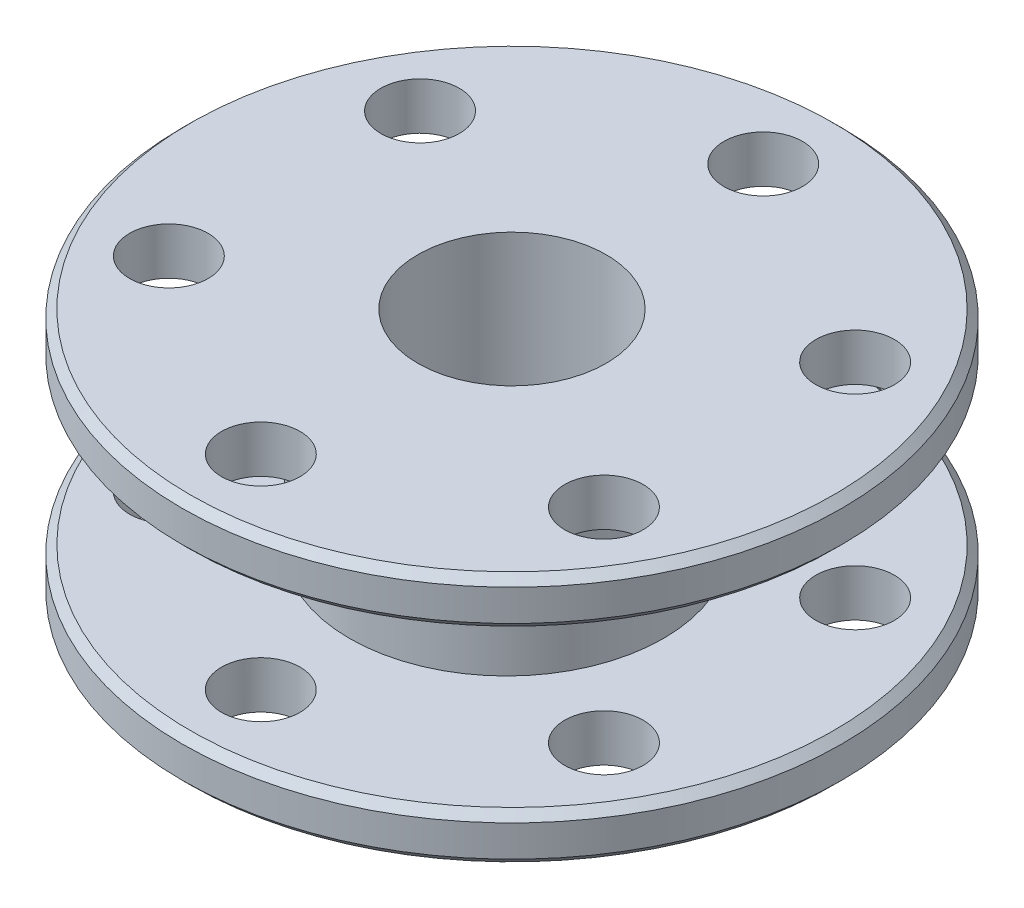
ISO-10303-21;
HEADER;
FILE_DESCRIPTION(('STEP AP214'),'2;1');
FILE_NAME('part.step','',(''),(''),'','','');
FILE_SCHEMA(('AUTOMOTIVE_DESIGN { 1 0 10303 214 1 1 1 1 }'));
ENDSEC;
DATA;
#1=APPLICATION_CONTEXT('core data for automotive mechanical design processes');
#2=APPLICATION_PROTOCOL_DEFINITION('international standard','automotive_design',2000,#1);
#3=PRODUCT_CONTEXT('',#1,'mechanical');
#4=PRODUCT('Part','Part','',(#3));
#5=PRODUCT_RELATED_PRODUCT_CATEGORY('part','',(#4));
#6=PRODUCT_DEFINITION_FORMATION('','',#4);
#7=PRODUCT_DEFINITION_CONTEXT('part definition',#1,'design');
#8=PRODUCT_DEFINITION('design','',#6,#7);
#9=PRODUCT_DEFINITION_SHAPE('','',#8);
#10=(LENGTH_UNIT() NAMED_UNIT(*) SI_UNIT(.MILLI.,.METRE.));
#11=(NAMED_UNIT(*) PLANE_ANGLE_UNIT() SI_UNIT($,.RADIAN.));
#12=(NAMED_UNIT(*) SI_UNIT($,.STERADIAN.) SOLID_ANGLE_UNIT());
#13=UNCERTAINTY_MEASURE_WITH_UNIT(LENGTH_MEASURE(1.E-05),#10,'distance_accuracy_value','');
#14=(GEOMETRIC_REPRESENTATION_CONTEXT(3) GLOBAL_UNCERTAINTY_ASSIGNED_CONTEXT((#13)) GLOBAL_UNIT_ASSIGNED_CONTEXT((#10,
#11,#12)) REPRESENTATION_CONTEXT('',''));
#15=CARTESIAN_POINT('',(0.,0.,0.));
#16=DIRECTION('',(0.,0.,1.));
#17=DIRECTION('',(1.,0.,0.));
#18=AXIS2_PLACEMENT_3D('',#15,#16,#17);
#19=CARTESIAN_POINT('',(0.,16.,0.));
#20=DIRECTION('',(0.,-1.,0.));
#21=DIRECTION('',(0.,0.,-1.));
#22=AXIS2_PLACEMENT_3D('',#19,#20,#21);
#23=CYLINDRICAL_SURFACE('',#22,21.);
#24=CARTESIAN_POINT('',(0.,0.499999999999994,0.));
#25=DIRECTION('',(0.,1.,0.));
#26=DIRECTION('',(0.,0.,1.));
#27=AXIS2_PLACEMENT_3D('',#24,#25,#26);
#28=CIRCLE('',#27,21.);
#29=CARTESIAN_POINT('',(0.,0.499999999999994,21.));
#30=VERTEX_POINT('',#29);
#31=EDGE_CURVE('E70',#30,#30,#28,.T.);
#32=ORIENTED_EDGE('',*,*,#31,.T.);
#33=EDGE_LOOP('',(#32));
#34=FACE_BOUND('',#33,.T.);
#35=CARTESIAN_POINT('',(0.,2.49999999999999,0.));
#36=DIRECTION('',(0.,-1.,0.));
#37=DIRECTION('',(0.,0.,-1.));
#38=AXIS2_PLACEMENT_3D('',#35,#36,#37);
#39=CIRCLE('',#38,21.);
#40=CARTESIAN_POINT('',(0.,2.49999999999999,-21.));
#41=VERTEX_POINT('',#40);
#42=EDGE_CURVE('E73',#41,#41,#39,.T.);
#43=ORIENTED_EDGE('',*,*,#42,.T.);
#44=EDGE_LOOP('',(#43));
#45=FACE_BOUND('',#44,.T.);
#46=ADVANCED_FACE('F43',(#34,#45),#23,.T.);
#47=CARTESIAN_POINT('',(0.,16.,-16.));
#48=DIRECTION('',(0.,-1.,0.));
#49=DIRECTION('',(0.,0.,-1.));
#50=AXIS2_PLACEMENT_3D('',#47,#48,#49);
#51=CYLINDRICAL_SURFACE('',#50,2.5);
#52=CARTESIAN_POINT('',(0.,3.,-16.));
#53=DIRECTION('',(0.,-1.,0.));
#54=DIRECTION('',(0.,0.,-1.));
#55=AXIS2_PLACEMENT_3D('',#52,#53,#54);
#56=CIRCLE('',#55,2.5);
#57=CARTESIAN_POINT('',(0.,3.,-18.5));
#58=VERTEX_POINT('',#57);
#59=EDGE_CURVE('E126',#58,#58,#56,.T.);
#60=ORIENTED_EDGE('',*,*,#59,.F.);
#61=EDGE_LOOP('',(#60));
#62=FACE_BOUND('',#61,.T.);
#63=CARTESIAN_POINT('',(0.,0.,-16.));
#64=DIRECTION('',(0.,1.,0.));
#65=DIRECTION('',(0.,0.,1.));
#66=AXIS2_PLACEMENT_3D('',#63,#64,#65);
#67=CIRCLE('',#66,2.5);
#68=CARTESIAN_POINT('',(0.,0.,-13.5));
#69=VERTEX_POINT('',#68);
#70=EDGE_CURVE('E93',#69,#69,#67,.T.);
#71=ORIENTED_EDGE('',*,*,#70,.F.);
#72=EDGE_LOOP('',(#71));
#73=FACE_BOUND('',#72,.T.);
#74=ADVANCED_FACE('F186',(#62,#73),#51,.F.);
#75=CARTESIAN_POINT('',(13.8564064605512,16.,-8.0000000000004));
#76=DIRECTION('',(0.,-1.,0.));
#77=DIRECTION('',(0.,0.,-1.));
#78=AXIS2_PLACEMENT_3D('',#75,#76,#77);
#79=CYLINDRICAL_SURFACE('',#78,2.50000000000014);
#80=CARTESIAN_POINT('',(13.8564064605512,3.,-8.0000000000004));
#81=DIRECTION('',(0.,-1.,0.));
#82=DIRECTION('',(0.,0.,-1.));
#83=AXIS2_PLACEMENT_3D('',#80,#81,#82);
#84=CIRCLE('',#83,2.50000000000014);
#85=CARTESIAN_POINT('',(13.8564064605512,3.,-10.5000000000005));
#86=VERTEX_POINT('',#85);
#87=EDGE_CURVE('E131',#86,#86,#84,.T.);
#88=ORIENTED_EDGE('',*,*,#87,.F.);
#89=EDGE_LOOP('',(#88));
#90=FACE_BOUND('',#89,.T.);
#91=CARTESIAN_POINT('',(13.8564064605512,0.,-8.0000000000004));
#92=DIRECTION('',(0.,1.,0.));
#93=DIRECTION('',(0.,0.,1.));
#94=AXIS2_PLACEMENT_3D('',#91,#92,#93);
#95=CIRCLE('',#94,2.50000000000014);
#96=CARTESIAN_POINT('',(13.8564064605512,0.,-5.50000000000025));
#97=VERTEX_POINT('',#96);
#98=EDGE_CURVE('E99',#97,#97,#95,.T.);
#99=ORIENTED_EDGE('',*,*,#98,.F.);
#100=EDGE_LOOP('',(#99));
#101=FACE_BOUND('',#100,.T.);
#102=ADVANCED_FACE('F230',(#90,#101),#79,.F.);
#103=CARTESIAN_POINT('',(13.8564064605517,16.,7.99999999999961));
#104=DIRECTION('',(0.,-1.,0.));
#105=DIRECTION('',(0.,0.,-1.));
#106=AXIS2_PLACEMENT_3D('',#103,#104,#105);
#107=CYLINDRICAL_SURFACE('',#106,2.50000000000061);
#108=CARTESIAN_POINT('',(13.8564064605517,3.,7.99999999999961));
#109=DIRECTION('',(0.,-1.,0.));
#110=DIRECTION('',(0.,0.,-1.));
#111=AXIS2_PLACEMENT_3D('',#108,#109,#110);
#112=CIRCLE('',#111,2.50000000000061);
#113=CARTESIAN_POINT('',(13.8564064605517,3.,5.499999999999));
#114=VERTEX_POINT('',#113);
#115=EDGE_CURVE('E134',#114,#114,#112,.T.);
#116=ORIENTED_EDGE('',*,*,#115,.F.);
#117=EDGE_LOOP('',(#116));
#118=FACE_BOUND('',#117,.T.);
#119=CARTESIAN_POINT('',(13.8564064605517,0.,7.99999999999961));
#120=DIRECTION('',(0.,1.,0.));
#121=DIRECTION('',(0.,0.,1.));
#122=AXIS2_PLACEMENT_3D('',#119,#120,#121);
#123=CIRCLE('',#122,2.50000000000061);
#124=CARTESIAN_POINT('',(13.8564064605517,0.,10.5000000000002));
#125=VERTEX_POINT('',#124);
#126=EDGE_CURVE('E105',#125,#125,#123,.T.);
#127=ORIENTED_EDGE('',*,*,#126,.F.);
#128=EDGE_LOOP('',(#127));
#129=FACE_BOUND('',#128,.T.);
#130=ADVANCED_FACE('F300',(#118,#129),#107,.F.);
#131=CARTESIAN_POINT('',(9.03616397137021E-13,16.,16.));
#132=DIRECTION('',(0.,-1.,0.));
#133=DIRECTION('',(0.,0.,-1.));
#134=AXIS2_PLACEMENT_3D('',#131,#132,#133);
#135=CYLINDRICAL_SURFACE('',#134,2.50000000000097);
#136=CARTESIAN_POINT('',(9.03616397137021E-13,3.,16.));
#137=DIRECTION('',(0.,-1.,0.));
#138=DIRECTION('',(0.,0.,-1.));
#139=AXIS2_PLACEMENT_3D('',#136,#137,#138);
#140=CIRCLE('',#139,2.50000000000097);
#141=CARTESIAN_POINT('',(9.03616397137021E-13,3.,13.499999999999));
#142=VERTEX_POINT('',#141);
#143=EDGE_CURVE('E137',#142,#142,#140,.T.);
#144=ORIENTED_EDGE('',*,*,#143,.F.);
#145=EDGE_LOOP('',(#144));
#146=FACE_BOUND('',#145,.T.);
#147=CARTESIAN_POINT('',(9.03616397137021E-13,0.,16.));
#148=DIRECTION('',(0.,1.,0.));
#149=DIRECTION('',(0.,0.,1.));
#150=AXIS2_PLACEMENT_3D('',#147,#148,#149);
#151=CIRCLE('',#150,2.50000000000097);
#152=CARTESIAN_POINT('',(9.03616397137021E-13,0.,18.500000000001));
#153=VERTEX_POINT('',#152);
#154=EDGE_CURVE('E111',#153,#153,#151,.T.);
#155=ORIENTED_EDGE('',*,*,#154,.F.);
#156=EDGE_LOOP('',(#155));
#157=FACE_BOUND('',#156,.T.);
#158=ADVANCED_FACE('F295',(#146,#157),#135,.F.);
#159=CARTESIAN_POINT('',(-13.8564064605503,16.,8.0000000000004));
#160=DIRECTION('',(0.,-1.,0.));
#161=DIRECTION('',(0.,0.,-1.));
#162=AXIS2_PLACEMENT_3D('',#159,#160,#161);
#163=CYLINDRICAL_SURFACE('',#162,2.50000000000091);
#164=CARTESIAN_POINT('',(-13.8564064605503,3.,8.0000000000004));
#165=DIRECTION('',(0.,-1.,0.));
#166=DIRECTION('',(0.,0.,-1.));
#167=AXIS2_PLACEMENT_3D('',#164,#165,#166);
#168=CIRCLE('',#167,2.50000000000091);
#169=CARTESIAN_POINT('',(-13.8564064605503,3.,5.49999999999949));
#170=VERTEX_POINT('',#169);
#171=EDGE_CURVE('E80',#170,#170,#168,.T.);
#172=ORIENTED_EDGE('',*,*,#171,.F.);
#173=EDGE_LOOP('',(#172));
#174=FACE_BOUND('',#173,.T.);
#175=CARTESIAN_POINT('',(-13.8564064605503,0.,8.0000000000004));
#176=DIRECTION('',(0.,1.,0.));
#177=DIRECTION('',(0.,0.,1.));
#178=AXIS2_PLACEMENT_3D('',#175,#176,#177);
#179=CIRCLE('',#178,2.50000000000091);
#180=CARTESIAN_POINT('',(-13.8564064605503,0.,10.5000000000013));
#181=VERTEX_POINT('',#180);
#182=EDGE_CURVE('E117',#181,#181,#179,.T.);
#183=ORIENTED_EDGE('',*,*,#182,.F.);
#184=EDGE_LOOP('',(#183));
#185=FACE_BOUND('',#184,.T.);
#186=ADVANCED_FACE('F219',(#174,#185),#163,.F.);
#187=CARTESIAN_POINT('',(-13.8564064605508,16.,-7.9999999999996));
#188=DIRECTION('',(0.,-1.,0.));
#189=DIRECTION('',(0.,0.,-1.));
#190=AXIS2_PLACEMENT_3D('',#187,#188,#189);
#191=CYLINDRICAL_SURFACE('',#190,2.50000000000052);
#192=CARTESIAN_POINT('',(-13.8564064605508,3.,-7.9999999999996));
#193=DIRECTION('',(0.,-1.,0.));
#194=DIRECTION('',(0.,0.,-1.));
#195=AXIS2_PLACEMENT_3D('',#192,#193,#194);
#196=CIRCLE('',#195,2.50000000000052);
#197=CARTESIAN_POINT('',(-13.8564064605508,3.,-10.5000000000001));
#198=VERTEX_POINT('',#197);
#199=EDGE_CURVE('E77',#198,#198,#196,.T.);
#200=ORIENTED_EDGE('',*,*,#199,.F.);
#201=EDGE_LOOP('',(#200));
#202=FACE_BOUND('',#201,.T.);
#203=CARTESIAN_POINT('',(-13.8564064605508,0.,-7.9999999999996));
#204=DIRECTION('',(0.,1.,0.));
#205=DIRECTION('',(0.,0.,1.));
#206=AXIS2_PLACEMENT_3D('',#203,#204,#205);
#207=CIRCLE('',#206,2.50000000000052);
#208=CARTESIAN_POINT('',(-13.8564064605508,0.,-5.49999999999908));
#209=VERTEX_POINT('',#208);
#210=EDGE_CURVE('E123',#209,#209,#207,.T.);
#211=ORIENTED_EDGE('',*,*,#210,.F.);
#212=EDGE_LOOP('',(#211));
#213=FACE_BOUND('',#212,.T.);
#214=ADVANCED_FACE('F193',(#202,#213),#191,.F.);
#215=CARTESIAN_POINT('',(0.,16.,0.));
#216=DIRECTION('',(0.,1.,0.));
#217=DIRECTION('',(0.,0.,1.));
#218=AXIS2_PLACEMENT_3D('',#215,#216,#217);
#219=PLANE('',#218);
#220=CARTESIAN_POINT('',(0.,16.,0.));
#221=DIRECTION('',(0.,1.,0.));
#222=DIRECTION('',(0.,0.,1.));
#223=AXIS2_PLACEMENT_3D('',#220,#221,#222);
#224=CIRCLE('',#223,20.5);
#225=CARTESIAN_POINT('',(0.,16.,20.5));
#226=VERTEX_POINT('',#225);
#227=EDGE_CURVE('E59',#226,#226,#224,.T.);
#228=ORIENTED_EDGE('',*,*,#227,.T.);
#229=EDGE_LOOP('',(#228));
#230=FACE_BOUND('',#229,.T.);
#231=CARTESIAN_POINT('',(-13.8564064605503,16.,8.0000000000004));
#232=DIRECTION('',(0.,1.,0.));
#233=DIRECTION('',(0.,0.,1.));
#234=AXIS2_PLACEMENT_3D('',#231,#232,#233);
#235=CIRCLE('',#234,2.50000000000091);
#236=CARTESIAN_POINT('',(-13.8564064605503,16.,10.5000000000013));
#237=VERTEX_POINT('',#236);
#238=EDGE_CURVE('E114',#237,#237,#235,.T.);
#239=ORIENTED_EDGE('',*,*,#238,.F.);
#240=EDGE_LOOP('',(#239));
#241=FACE_BOUND('',#240,.T.);
#242=CARTESIAN_POINT('',(13.8564064605517,16.,7.99999999999961));
#243=DIRECTION('',(0.,1.,0.));
#244=DIRECTION('',(0.,0.,1.));
#245=AXIS2_PLACEMENT_3D('',#242,#243,#244);
#246=CIRCLE('',#245,2.50000000000061);
#247=CARTESIAN_POINT('',(13.8564064605517,16.,10.5000000000002));
#248=VERTEX_POINT('',#247);
#249=EDGE_CURVE('E102',#248,#248,#246,.T.);
#250=ORIENTED_EDGE('',*,*,#249,.F.);
#251=EDGE_LOOP('',(#250));
#252=FACE_BOUND('',#251,.T.);
#253=CARTESIAN_POINT('',(0.,16.,-16.));
#254=DIRECTION('',(0.,1.,0.));
#255=DIRECTION('',(0.,0.,1.));
#256=AXIS2_PLACEMENT_3D('',#253,#254,#255);
#257=CIRCLE('',#256,2.5);
#258=CARTESIAN_POINT('',(0.,16.,-13.5));
#259=VERTEX_POINT('',#258);
#260=EDGE_CURVE('E90',#259,#259,#257,.T.);
#261=ORIENTED_EDGE('',*,*,#260,.F.);
#262=EDGE_LOOP('',(#261));
#263=FACE_BOUND('',#262,.T.);
#264=CARTESIAN_POINT('',(0.,16.,0.));
#265=DIRECTION('',(0.,1.,0.));
#266=DIRECTION('',(0.,0.,1.));
#267=AXIS2_PLACEMENT_3D('',#264,#265,#266);
#268=CIRCLE('',#267,6.);
#269=CARTESIAN_POINT('',(0.,16.,6.));
#270=VERTEX_POINT('',#269);
#271=EDGE_CURVE('E76',#270,#270,#268,.T.);
#272=ORIENTED_EDGE('',*,*,#271,.F.);
#273=EDGE_LOOP('',(#272));
#274=FACE_BOUND('',#273,.T.);
#275=CARTESIAN_POINT('',(13.8564064605512,16.,-8.0000000000004));
#276=DIRECTION('',(0.,1.,0.));
#277=DIRECTION('',(0.,0.,1.));
#278=AXIS2_PLACEMENT_3D('',#275,#276,#277);
#279=CIRCLE('',#278,2.50000000000014);
#280=CARTESIAN_POINT('',(13.8564064605512,16.,-5.50000000000025));
#281=VERTEX_POINT('',#280);
#282=EDGE_CURVE('E96',#281,#281,#279,.T.);
#283=ORIENTED_EDGE('',*,*,#282,.F.);
#284=EDGE_LOOP('',(#283));
#285=FACE_BOUND('',#284,.T.);
#286=CARTESIAN_POINT('',(9.03616397137021E-13,16.,16.));
#287=DIRECTION('',(0.,1.,0.));
#288=DIRECTION('',(0.,0.,1.));
#289=AXIS2_PLACEMENT_3D('',#286,#287,#288);
#290=CIRCLE('',#289,2.50000000000097);
#291=CARTESIAN_POINT('',(9.03616397137021E-13,16.,18.500000000001));
#292=VERTEX_POINT('',#291);
#293=EDGE_CURVE('E108',#292,#292,#290,.T.);
#294=ORIENTED_EDGE('',*,*,#293,.F.);
#295=EDGE_LOOP('',(#294));
#296=FACE_BOUND('',#295,.T.);
#297=CARTESIAN_POINT('',(-13.8564064605508,16.,-7.9999999999996));
#298=DIRECTION('',(0.,1.,0.));
#299=DIRECTION('',(0.,0.,1.));
#300=AXIS2_PLACEMENT_3D('',#297,#298,#299);
#301=CIRCLE('',#300,2.50000000000052);
#302=CARTESIAN_POINT('',(-13.8564064605508,16.,-5.49999999999908));
#303=VERTEX_POINT('',#302);
#304=EDGE_CURVE('E120',#303,#303,#301,.T.);
#305=ORIENTED_EDGE('',*,*,#304,.F.);
#306=EDGE_LOOP('',(#305));
#307=FACE_BOUND('',#306,.T.);
#308=ADVANCED_FACE('F189',(#230,#241,#252,#263,#274,#285,#296,#307),#219,.T.);
#309=CARTESIAN_POINT('',(0.,0.,0.));
#310=DIRECTION('',(0.,1.,0.));
#311=DIRECTION('',(0.,0.,1.));
#312=AXIS2_PLACEMENT_3D('',#309,#310,#311);
#313=PLANE('',#312);
#314=CARTESIAN_POINT('',(0.,0.,0.));
#315=DIRECTION('',(0.,1.,0.));
#316=DIRECTION('',(0.,0.,1.));
#317=AXIS2_PLACEMENT_3D('',#314,#315,#316);
#318=CIRCLE('',#317,20.5);
#319=CARTESIAN_POINT('',(0.,0.,20.5));
#320=VERTEX_POINT('',#319);
#321=EDGE_CURVE('E67',#320,#320,#318,.F.);
#322=ORIENTED_EDGE('',*,*,#321,.T.);
#323=EDGE_LOOP('',(#322));
#324=FACE_BOUND('',#323,.T.);
#325=CARTESIAN_POINT('',(0.,0.,0.));
#326=DIRECTION('',(0.,1.,0.));
#327=DIRECTION('',(0.,0.,1.));
#328=AXIS2_PLACEMENT_3D('',#325,#326,#327);
#329=CIRCLE('',#328,6.);
#330=CARTESIAN_POINT('',(0.,0.,6.));
#331=VERTEX_POINT('',#330);
#332=EDGE_CURVE('E87',#331,#331,#329,.T.);
#333=ORIENTED_EDGE('',*,*,#332,.T.);
#334=EDGE_LOOP('',(#333));
#335=FACE_BOUND('',#334,.T.);
#336=ORIENTED_EDGE('',*,*,#70,.T.);
#337=EDGE_LOOP('',(#336));
#338=FACE_BOUND('',#337,.T.);
#339=ORIENTED_EDGE('',*,*,#98,.T.);
#340=EDGE_LOOP('',(#339));
#341=FACE_BOUND('',#340,.T.);
#342=ORIENTED_EDGE('',*,*,#126,.T.);
#343=EDGE_LOOP('',(#342));
#344=FACE_BOUND('',#343,.T.);
#345=ORIENTED_EDGE('',*,*,#154,.T.);
#346=EDGE_LOOP('',(#345));
#347=FACE_BOUND('',#346,.T.);
#348=ORIENTED_EDGE('',*,*,#182,.T.);
#349=EDGE_LOOP('',(#348));
#350=FACE_BOUND('',#349,.T.);
#351=ORIENTED_EDGE('',*,*,#210,.T.);
#352=EDGE_LOOP('',(#351));
#353=FACE_BOUND('',#352,.T.);
#354=ADVANCED_FACE('F192',(#324,#335,#338,#341,#344,#347,#350,#353),#313,.F.);
#355=CARTESIAN_POINT('',(0.,15.5,0.));
#356=DIRECTION('',(0.,1.,0.));
#357=DIRECTION('',(0.,0.,1.));
#358=AXIS2_PLACEMENT_3D('',#355,#356,#357);
#359=CIRCLE('',#358,21.);
#360=CARTESIAN_POINT('',(0.,15.5,21.));
#361=VERTEX_POINT('',#360);
#362=EDGE_CURVE('E51',#361,#361,#359,.F.);
#363=ORIENTED_EDGE('',*,*,#362,.T.);
#364=EDGE_LOOP('',(#363));
#365=FACE_BOUND('',#364,.T.);
#366=CARTESIAN_POINT('',(0.,13.5,0.));
#367=DIRECTION('',(0.,1.,0.));
#368=DIRECTION('',(0.,0.,1.));
#369=AXIS2_PLACEMENT_3D('',#366,#367,#368);
#370=CIRCLE('',#369,21.);
#371=CARTESIAN_POINT('',(0.,13.5,21.));
#372=VERTEX_POINT('',#371);
#373=EDGE_CURVE('E55',#372,#372,#370,.T.);
#374=ORIENTED_EDGE('',*,*,#373,.T.);
#375=EDGE_LOOP('',(#374));
#376=FACE_BOUND('',#375,.T.);
#377=ADVANCED_FACE('F226',(#365,#376),#23,.T.);
#378=CARTESIAN_POINT('',(0.,16.,0.));
#379=DIRECTION('',(0.,-1.,0.));
#380=DIRECTION('',(0.,0.,-1.));
#381=AXIS2_PLACEMENT_3D('',#378,#379,#380);
#382=CYLINDRICAL_SURFACE('',#381,6.);
#383=ORIENTED_EDGE('',*,*,#271,.T.);
#384=EDGE_LOOP('',(#383));
#385=FACE_BOUND('',#384,.T.);
#386=ORIENTED_EDGE('',*,*,#332,.F.);
#387=EDGE_LOOP('',(#386));
#388=FACE_BOUND('',#387,.T.);
#389=ADVANCED_FACE('F184',(#385,#388),#382,.F.);
#390=CARTESIAN_POINT('',(0.,13.,-16.));
#391=DIRECTION('',(0.,1.,0.));
#392=DIRECTION('',(0.,0.,1.));
#393=AXIS2_PLACEMENT_3D('',#390,#391,#392);
#394=CIRCLE('',#393,2.5);
#395=CARTESIAN_POINT('',(0.,13.,-13.5));
#396=VERTEX_POINT('',#395);
#397=EDGE_CURVE('E81',#396,#396,#394,.T.);
#398=ORIENTED_EDGE('',*,*,#397,.F.);
#399=EDGE_LOOP('',(#398));
#400=FACE_BOUND('',#399,.T.);
#401=ORIENTED_EDGE('',*,*,#260,.T.);
#402=EDGE_LOOP('',(#401));
#403=FACE_BOUND('',#402,.T.);
#404=ADVANCED_FACE('F180',(#400,#403),#51,.F.);
#405=CARTESIAN_POINT('',(13.8564064605512,13.,-8.0000000000004));
#406=DIRECTION('',(0.,1.,0.));
#407=DIRECTION('',(0.,0.,1.));
#408=AXIS2_PLACEMENT_3D('',#405,#406,#407);
#409=CIRCLE('',#408,2.50000000000014);
#410=CARTESIAN_POINT('',(13.8564064605512,13.,-5.50000000000025));
#411=VERTEX_POINT('',#410);
#412=EDGE_CURVE('E144',#411,#411,#409,.T.);
#413=ORIENTED_EDGE('',*,*,#412,.F.);
#414=EDGE_LOOP('',(#413));
#415=FACE_BOUND('',#414,.T.);
#416=ORIENTED_EDGE('',*,*,#282,.T.);
#417=EDGE_LOOP('',(#416));
#418=FACE_BOUND('',#417,.T.);
#419=ADVANCED_FACE('F183',(#415,#418),#79,.F.);
#420=CARTESIAN_POINT('',(13.8564064605517,13.,7.99999999999961));
#421=DIRECTION('',(0.,1.,0.));
#422=DIRECTION('',(0.,0.,1.));
#423=AXIS2_PLACEMENT_3D('',#420,#421,#422);
#424=CIRCLE('',#423,2.50000000000061);
#425=CARTESIAN_POINT('',(13.8564064605517,13.,10.5000000000002));
#426=VERTEX_POINT('',#425);
#427=EDGE_CURVE('E147',#426,#426,#424,.T.);
#428=ORIENTED_EDGE('',*,*,#427,.F.);
#429=EDGE_LOOP('',(#428));
#430=FACE_BOUND('',#429,.T.);
#431=ORIENTED_EDGE('',*,*,#249,.T.);
#432=EDGE_LOOP('',(#431));
#433=FACE_BOUND('',#432,.T.);
#434=ADVANCED_FACE('F306',(#430,#433),#107,.F.);
#435=CARTESIAN_POINT('',(9.03616397137021E-13,13.,16.));
#436=DIRECTION('',(0.,1.,0.));
#437=DIRECTION('',(0.,0.,1.));
#438=AXIS2_PLACEMENT_3D('',#435,#436,#437);
#439=CIRCLE('',#438,2.50000000000097);
#440=CARTESIAN_POINT('',(9.03616397137021E-13,13.,18.500000000001));
#441=VERTEX_POINT('',#440);
#442=EDGE_CURVE('E150',#441,#441,#439,.T.);
#443=ORIENTED_EDGE('',*,*,#442,.F.);
#444=EDGE_LOOP('',(#443));
#445=FACE_BOUND('',#444,.T.);
#446=ORIENTED_EDGE('',*,*,#293,.T.);
#447=EDGE_LOOP('',(#446));
#448=FACE_BOUND('',#447,.T.);
#449=ADVANCED_FACE('F216',(#445,#448),#135,.F.);
#450=CARTESIAN_POINT('',(-13.8564064605503,13.,8.0000000000004));
#451=DIRECTION('',(0.,1.,0.));
#452=DIRECTION('',(0.,0.,1.));
#453=AXIS2_PLACEMENT_3D('',#450,#451,#452);
#454=CIRCLE('',#453,2.50000000000091);
#455=CARTESIAN_POINT('',(-13.8564064605503,13.,10.5000000000013));
#456=VERTEX_POINT('',#455);
#457=EDGE_CURVE('E85',#456,#456,#454,.T.);
#458=ORIENTED_EDGE('',*,*,#457,.F.);
#459=EDGE_LOOP('',(#458));
#460=FACE_BOUND('',#459,.T.);
#461=ORIENTED_EDGE('',*,*,#238,.T.);
#462=EDGE_LOOP('',(#461));
#463=FACE_BOUND('',#462,.T.);
#464=ADVANCED_FACE('F206',(#460,#463),#163,.F.);
#465=CARTESIAN_POINT('',(-13.8564064605508,13.,-7.9999999999996));
#466=DIRECTION('',(0.,1.,0.));
#467=DIRECTION('',(0.,0.,1.));
#468=AXIS2_PLACEMENT_3D('',#465,#466,#467);
#469=CIRCLE('',#468,2.50000000000052);
#470=CARTESIAN_POINT('',(-13.8564064605508,13.,-5.49999999999908));
#471=VERTEX_POINT('',#470);
#472=EDGE_CURVE('E82',#471,#471,#469,.T.);
#473=ORIENTED_EDGE('',*,*,#472,.F.);
#474=EDGE_LOOP('',(#473));
#475=FACE_BOUND('',#474,.T.);
#476=ORIENTED_EDGE('',*,*,#304,.T.);
#477=EDGE_LOOP('',(#476));
#478=FACE_BOUND('',#477,.T.);
#479=ADVANCED_FACE('F204',(#475,#478),#191,.F.);
#480=CARTESIAN_POINT('',(0.,3.,-9.65103879917385));
#481=DIRECTION('',(0.,-1.,0.));
#482=DIRECTION('',(0.,0.,-1.));
#483=AXIS2_PLACEMENT_3D('',#480,#481,#482);
#484=PLANE('',#483);
#485=CARTESIAN_POINT('',(0.,3.,0.));
#486=DIRECTION('',(0.,-1.,0.));
#487=DIRECTION('',(0.,0.,-1.));
#488=AXIS2_PLACEMENT_3D('',#485,#486,#487);
#489=CIRCLE('',#488,20.5);
#490=CARTESIAN_POINT('',(0.,3.,-20.5));
#491=VERTEX_POINT('',#490);
#492=EDGE_CURVE('E64',#491,#491,#489,.F.);
#493=ORIENTED_EDGE('',*,*,#492,.T.);
#494=EDGE_LOOP('',(#493));
#495=FACE_BOUND('',#494,.T.);
#496=CARTESIAN_POINT('',(0.,3.,0.348961200826149));
#497=DIRECTION('',(0.,-1.,0.));
#498=DIRECTION('',(0.,0.,-1.));
#499=AXIS2_PLACEMENT_3D('',#496,#497,#498);
#500=CIRCLE('',#499,10.);
#501=CARTESIAN_POINT('',(0.,3.,-9.65103879917385));
#502=VERTEX_POINT('',#501);
#503=EDGE_CURVE('E86',#502,#502,#500,.T.);
#504=ORIENTED_EDGE('',*,*,#503,.T.);
#505=EDGE_LOOP('',(#504));
#506=FACE_BOUND('',#505,.T.);
#507=ORIENTED_EDGE('',*,*,#199,.T.);
#508=EDGE_LOOP('',(#507));
#509=FACE_BOUND('',#508,.T.);
#510=ORIENTED_EDGE('',*,*,#171,.T.);
#511=EDGE_LOOP('',(#510));
#512=FACE_BOUND('',#511,.T.);
#513=ORIENTED_EDGE('',*,*,#143,.T.);
#514=EDGE_LOOP('',(#513));
#515=FACE_BOUND('',#514,.T.);
#516=ORIENTED_EDGE('',*,*,#115,.T.);
#517=EDGE_LOOP('',(#516));
#518=FACE_BOUND('',#517,.T.);
#519=ORIENTED_EDGE('',*,*,#87,.T.);
#520=EDGE_LOOP('',(#519));
#521=FACE_BOUND('',#520,.T.);
#522=ORIENTED_EDGE('',*,*,#59,.T.);
#523=EDGE_LOOP('',(#522));
#524=FACE_BOUND('',#523,.T.);
#525=ADVANCED_FACE('F166',(#495,#506,#509,#512,#515,#518,#521,#524),#484,.F.);
#526=CARTESIAN_POINT('',(0.,13.,-9.65103879917385));
#527=DIRECTION('',(0.,1.,0.));
#528=DIRECTION('',(0.,0.,1.));
#529=AXIS2_PLACEMENT_3D('',#526,#527,#528);
#530=PLANE('',#529);
#531=CARTESIAN_POINT('',(0.,13.,0.));
#532=DIRECTION('',(0.,1.,0.));
#533=DIRECTION('',(0.,0.,1.));
#534=AXIS2_PLACEMENT_3D('',#531,#532,#533);
#535=CIRCLE('',#534,20.5);
#536=CARTESIAN_POINT('',(0.,13.,20.5));
#537=VERTEX_POINT('',#536);
#538=EDGE_CURVE('E10',#537,#537,#535,.F.);
#539=ORIENTED_EDGE('',*,*,#538,.T.);
#540=EDGE_LOOP('',(#539));
#541=FACE_BOUND('',#540,.T.);
#542=CARTESIAN_POINT('',(0.,13.,0.348961200826149));
#543=DIRECTION('',(0.,-1.,0.));
#544=DIRECTION('',(0.,0.,-1.));
#545=AXIS2_PLACEMENT_3D('',#542,#543,#544);
#546=CIRCLE('',#545,10.);
#547=CARTESIAN_POINT('',(0.,13.,-9.65103879917385));
#548=VERTEX_POINT('',#547);
#549=EDGE_CURVE('E157',#548,#548,#546,.T.);
#550=ORIENTED_EDGE('',*,*,#549,.F.);
#551=EDGE_LOOP('',(#550));
#552=FACE_BOUND('',#551,.T.);
#553=ORIENTED_EDGE('',*,*,#472,.T.);
#554=EDGE_LOOP('',(#553));
#555=FACE_BOUND('',#554,.T.);
#556=ORIENTED_EDGE('',*,*,#457,.T.);
#557=EDGE_LOOP('',(#556));
#558=FACE_BOUND('',#557,.T.);
#559=ORIENTED_EDGE('',*,*,#442,.T.);
#560=EDGE_LOOP('',(#559));
#561=FACE_BOUND('',#560,.T.);
#562=ORIENTED_EDGE('',*,*,#427,.T.);
#563=EDGE_LOOP('',(#562));
#564=FACE_BOUND('',#563,.T.);
#565=ORIENTED_EDGE('',*,*,#412,.T.);
#566=EDGE_LOOP('',(#565));
#567=FACE_BOUND('',#566,.T.);
#568=ORIENTED_EDGE('',*,*,#397,.T.);
#569=EDGE_LOOP('',(#568));
#570=FACE_BOUND('',#569,.T.);
#571=ADVANCED_FACE('F163',(#541,#552,#555,#558,#561,#564,#567,#570),#530,.F.);
#572=CARTESIAN_POINT('',(0.,0.,0.348961200826149));
#573=DIRECTION('',(0.,-1.,0.));
#574=DIRECTION('',(0.,0.,-1.));
#575=AXIS2_PLACEMENT_3D('',#572,#573,#574);
#576=CYLINDRICAL_SURFACE('',#575,10.);
#577=ORIENTED_EDGE('',*,*,#503,.F.);
#578=EDGE_LOOP('',(#577));
#579=FACE_BOUND('',#578,.T.);
#580=ORIENTED_EDGE('',*,*,#549,.T.);
#581=EDGE_LOOP('',(#580));
#582=FACE_BOUND('',#581,.T.);
#583=ADVANCED_FACE('F161',(#579,#582),#576,.T.);
#584=CARTESIAN_POINT('',(0.,0.499999999999994,0.));
#585=DIRECTION('',(0.,1.,0.));
#586=DIRECTION('',(0.,0.,1.));
#587=AXIS2_PLACEMENT_3D('',#584,#585,#586);
#588=CONICAL_SURFACE('',#587,21.,0.785398163397448);
#589=ORIENTED_EDGE('',*,*,#321,.F.);
#590=EDGE_LOOP('',(#589));
#591=FACE_BOUND('',#590,.T.);
#592=ORIENTED_EDGE('',*,*,#31,.F.);
#593=EDGE_LOOP('',(#592));
#594=FACE_BOUND('',#593,.T.);
#595=ADVANCED_FACE('F257',(#591,#594),#588,.T.);
#596=CARTESIAN_POINT('',(0.,2.49999999999999,0.));
#597=DIRECTION('',(0.,-1.,0.));
#598=DIRECTION('',(0.,0.,-1.));
#599=AXIS2_PLACEMENT_3D('',#596,#597,#598);
#600=CONICAL_SURFACE('',#599,21.,0.785398163397448);
#601=ORIENTED_EDGE('',*,*,#492,.F.);
#602=EDGE_LOOP('',(#601));
#603=FACE_BOUND('',#602,.T.);
#604=ORIENTED_EDGE('',*,*,#42,.F.);
#605=EDGE_LOOP('',(#604));
#606=FACE_BOUND('',#605,.T.);
#607=ADVANCED_FACE('F252',(#603,#606),#600,.T.);
#608=CARTESIAN_POINT('',(0.,16.,0.));
#609=DIRECTION('',(0.,-1.,0.));
#610=DIRECTION('',(0.,0.,-1.));
#611=AXIS2_PLACEMENT_3D('',#608,#609,#610);
#612=CONICAL_SURFACE('',#611,20.5,0.785398163397448);
#613=ORIENTED_EDGE('',*,*,#362,.F.);
#614=EDGE_LOOP('',(#613));
#615=FACE_BOUND('',#614,.T.);
#616=ORIENTED_EDGE('',*,*,#227,.F.);
#617=EDGE_LOOP('',(#616));
#618=FACE_BOUND('',#617,.T.);
#619=ADVANCED_FACE('F247',(#615,#618),#612,.T.);
#620=CARTESIAN_POINT('',(0.,13.5,0.));
#621=DIRECTION('',(0.,1.,0.));
#622=DIRECTION('',(0.,0.,1.));
#623=AXIS2_PLACEMENT_3D('',#620,#621,#622);
#624=CONICAL_SURFACE('',#623,21.,0.785398163397448);
#625=ORIENTED_EDGE('',*,*,#538,.F.);
#626=EDGE_LOOP('',(#625));
#627=FACE_BOUND('',#626,.T.);
#628=ORIENTED_EDGE('',*,*,#373,.F.);
#629=EDGE_LOOP('',(#628));
#630=FACE_BOUND('',#629,.T.);
#631=ADVANCED_FACE('F46',(#627,#630),#624,.T.);
#632=CLOSED_SHELL('',(#46,#74,#102,#130,#158,#186,#214,#308,#354,#377,#389,#404,#419,#434,#449,
#464,#479,#525,#571,#583,#595,#607,#619,#631));
#633=MANIFOLD_SOLID_BREP('B2',#632);
#634=ADVANCED_BREP_SHAPE_REPRESENTATION('',(#18,#633),#14);
#635=SHAPE_DEFINITION_REPRESENTATION(#9,#634);
ENDSEC;
END-ISO-10303-21;
